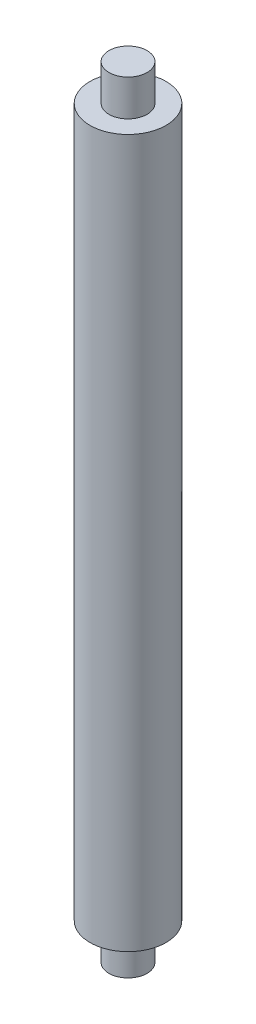
ISO-10303-21;
HEADER;
FILE_DESCRIPTION(('STEP AP214'),'2;1');
FILE_NAME('part.step','',(''),(''),'','','');
FILE_SCHEMA(('AUTOMOTIVE_DESIGN { 1 0 10303 214 1 1 1 1 }'));
ENDSEC;
DATA;
#1=APPLICATION_CONTEXT('core data for automotive mechanical design processes');
#2=APPLICATION_PROTOCOL_DEFINITION('international standard','automotive_design',2000,#1);
#3=PRODUCT_CONTEXT('',#1,'mechanical');
#4=PRODUCT('Part','Part','',(#3));
#5=PRODUCT_RELATED_PRODUCT_CATEGORY('part','',(#4));
#6=PRODUCT_DEFINITION_FORMATION('','',#4);
#7=PRODUCT_DEFINITION_CONTEXT('part definition',#1,'design');
#8=PRODUCT_DEFINITION('design','',#6,#7);
#9=PRODUCT_DEFINITION_SHAPE('','',#8);
#10=(LENGTH_UNIT() NAMED_UNIT(*) SI_UNIT(.MILLI.,.METRE.));
#11=(NAMED_UNIT(*) PLANE_ANGLE_UNIT() SI_UNIT($,.RADIAN.));
#12=(NAMED_UNIT(*) SI_UNIT($,.STERADIAN.) SOLID_ANGLE_UNIT());
#13=UNCERTAINTY_MEASURE_WITH_UNIT(LENGTH_MEASURE(1.E-05),#10,'distance_accuracy_value','');
#14=(GEOMETRIC_REPRESENTATION_CONTEXT(3) GLOBAL_UNCERTAINTY_ASSIGNED_CONTEXT((#13)) GLOBAL_UNIT_ASSIGNED_CONTEXT((#10,
#11,#12)) REPRESENTATION_CONTEXT('',''));
#15=CARTESIAN_POINT('',(0.,0.,0.));
#16=DIRECTION('',(0.,0.,1.));
#17=DIRECTION('',(1.,0.,0.));
#18=AXIS2_PLACEMENT_3D('',#15,#16,#17);
#19=CARTESIAN_POINT('',(0.,92.964,0.));
#20=DIRECTION('',(0.,-1.,0.));
#21=DIRECTION('',(0.,0.,1.));
#22=AXIS2_PLACEMENT_3D('',#19,#20,#21);
#23=CYLINDRICAL_SURFACE('',#22,5.);
#24=CARTESIAN_POINT('',(0.,92.964,0.));
#25=DIRECTION('',(0.,-1.,0.));
#26=DIRECTION('',(0.,0.,-1.));
#27=AXIS2_PLACEMENT_3D('',#24,#25,#26);
#28=CIRCLE('',#27,5.);
#29=CARTESIAN_POINT('',(0.,92.964,-5.));
#30=VERTEX_POINT('',#29);
#31=EDGE_CURVE('E55',#30,#30,#28,.T.);
#32=ORIENTED_EDGE('',*,*,#31,.T.);
#33=EDGE_LOOP('',(#32));
#34=FACE_BOUND('',#33,.T.);
#35=CARTESIAN_POINT('',(0.,0.,0.));
#36=DIRECTION('',(0.,-1.,0.));
#37=DIRECTION('',(0.,0.,-1.));
#38=AXIS2_PLACEMENT_3D('',#35,#36,#37);
#39=CIRCLE('',#38,5.);
#40=CARTESIAN_POINT('',(0.,0.,-5.));
#41=VERTEX_POINT('',#40);
#42=EDGE_CURVE('E46',#41,#41,#39,.T.);
#43=ORIENTED_EDGE('',*,*,#42,.F.);
#44=EDGE_LOOP('',(#43));
#45=FACE_BOUND('',#44,.T.);
#46=ADVANCED_FACE('F43',(#34,#45),#23,.T.);
#47=CARTESIAN_POINT('',(0.,92.964,0.));
#48=DIRECTION('',(0.,1.,0.));
#49=DIRECTION('',(0.,0.,-1.));
#50=AXIS2_PLACEMENT_3D('',#47,#48,#49);
#51=PLANE('',#50);
#52=CARTESIAN_POINT('',(0.,92.964,0.));
#53=DIRECTION('',(0.,-1.,0.));
#54=DIRECTION('',(0.,0.,-1.));
#55=AXIS2_PLACEMENT_3D('',#52,#53,#54);
#56=CIRCLE('',#55,2.5);
#57=CARTESIAN_POINT('',(0.,92.964,2.5));
#58=VERTEX_POINT('',#57);
#59=EDGE_CURVE('E50',#58,#58,#56,.T.);
#60=ORIENTED_EDGE('',*,*,#59,.T.);
#61=EDGE_LOOP('',(#60));
#62=FACE_BOUND('',#61,.T.);
#63=ORIENTED_EDGE('',*,*,#31,.F.);
#64=EDGE_LOOP('',(#63));
#65=FACE_BOUND('',#64,.T.);
#66=ADVANCED_FACE('F71',(#62,#65),#51,.T.);
#67=CARTESIAN_POINT('',(0.,0.,0.));
#68=DIRECTION('',(0.,1.,0.));
#69=DIRECTION('',(0.,0.,-1.));
#70=AXIS2_PLACEMENT_3D('',#67,#68,#69);
#71=PLANE('',#70);
#72=CARTESIAN_POINT('',(0.,0.,0.));
#73=DIRECTION('',(0.,1.,0.));
#74=DIRECTION('',(0.,0.,1.));
#75=AXIS2_PLACEMENT_3D('',#72,#73,#74);
#76=CIRCLE('',#75,2.5);
#77=CARTESIAN_POINT('',(0.,0.,-2.5));
#78=VERTEX_POINT('',#77);
#79=EDGE_CURVE('E10',#78,#78,#76,.T.);
#80=ORIENTED_EDGE('',*,*,#79,.T.);
#81=EDGE_LOOP('',(#80));
#82=FACE_BOUND('',#81,.T.);
#83=ORIENTED_EDGE('',*,*,#42,.T.);
#84=EDGE_LOOP('',(#83));
#85=FACE_BOUND('',#84,.T.);
#86=ADVANCED_FACE('F68',(#82,#85),#71,.F.);
#87=CARTESIAN_POINT('',(0.,97.7265,0.));
#88=DIRECTION('',(0.,-1.,0.));
#89=DIRECTION('',(0.,0.,1.));
#90=AXIS2_PLACEMENT_3D('',#87,#88,#89);
#91=CYLINDRICAL_SURFACE('',#90,2.5);
#92=CARTESIAN_POINT('',(0.,97.7265,0.));
#93=DIRECTION('',(0.,-1.,0.));
#94=DIRECTION('',(0.,0.,-1.));
#95=AXIS2_PLACEMENT_3D('',#92,#93,#94);
#96=CIRCLE('',#95,2.5);
#97=CARTESIAN_POINT('',(0.,97.7265,2.5));
#98=VERTEX_POINT('',#97);
#99=EDGE_CURVE('E60',#98,#98,#96,.T.);
#100=CARTESIAN_POINT('',(0.,97.7265,2.5));
#101=CARTESIAN_POINT('',(0.,97.676890625,2.5));
#102=CARTESIAN_POINT('',(0.,97.62728125,2.5));
#103=CARTESIAN_POINT('',(0.,97.5280625,2.5));
#104=CARTESIAN_POINT('',(0.,97.478453125,2.5));
#105=CARTESIAN_POINT('',(0.,97.379234375,2.5));
#106=CARTESIAN_POINT('',(0.,97.329625,2.5));
#107=CARTESIAN_POINT('',(0.,97.23040625,2.5));
#108=CARTESIAN_POINT('',(0.,97.180796875,2.5));
#109=CARTESIAN_POINT('',(0.,97.081578125,2.5));
#110=CARTESIAN_POINT('',(0.,97.03196875,2.5));
#111=CARTESIAN_POINT('',(0.,96.93275,2.5));
#112=CARTESIAN_POINT('',(0.,96.883140625,2.5));
#113=CARTESIAN_POINT('',(0.,96.783921875,2.5));
#114=CARTESIAN_POINT('',(0.,96.7343125,2.5));
#115=CARTESIAN_POINT('',(0.,96.63509375,2.5));
#116=CARTESIAN_POINT('',(0.,96.585484375,2.5));
#117=CARTESIAN_POINT('',(0.,96.486265625,2.5));
#118=CARTESIAN_POINT('',(0.,96.43665625,2.5));
#119=CARTESIAN_POINT('',(0.,96.3374375,2.5));
#120=CARTESIAN_POINT('',(0.,96.287828125,2.5));
#121=CARTESIAN_POINT('',(0.,96.188609375,2.5));
#122=CARTESIAN_POINT('',(0.,96.139,2.5));
#123=CARTESIAN_POINT('',(0.,96.03978125,2.5));
#124=CARTESIAN_POINT('',(0.,95.990171875,2.5));
#125=CARTESIAN_POINT('',(0.,95.890953125,2.5));
#126=CARTESIAN_POINT('',(0.,95.84134375,2.5));
#127=CARTESIAN_POINT('',(0.,95.742125,2.5));
#128=CARTESIAN_POINT('',(0.,95.692515625,2.5));
#129=CARTESIAN_POINT('',(0.,95.593296875,2.5));
#130=CARTESIAN_POINT('',(0.,95.5436875,2.5));
#131=CARTESIAN_POINT('',(0.,95.44446875,2.5));
#132=CARTESIAN_POINT('',(0.,95.394859375,2.5));
#133=CARTESIAN_POINT('',(0.,95.295640625,2.5));
#134=CARTESIAN_POINT('',(0.,95.24603125,2.5));
#135=CARTESIAN_POINT('',(0.,95.1468125,2.5));
#136=CARTESIAN_POINT('',(0.,95.097203125,2.5));
#137=CARTESIAN_POINT('',(0.,94.997984375,2.5));
#138=CARTESIAN_POINT('',(0.,94.948375,2.5));
#139=CARTESIAN_POINT('',(0.,94.84915625,2.5));
#140=CARTESIAN_POINT('',(0.,94.799546875,2.5));
#141=CARTESIAN_POINT('',(0.,94.700328125,2.5));
#142=CARTESIAN_POINT('',(0.,94.65071875,2.5));
#143=CARTESIAN_POINT('',(0.,94.5515,2.5));
#144=CARTESIAN_POINT('',(0.,94.501890625,2.5));
#145=CARTESIAN_POINT('',(0.,94.402671875,2.5));
#146=CARTESIAN_POINT('',(0.,94.3530625,2.5));
#147=CARTESIAN_POINT('',(0.,94.25384375,2.5));
#148=CARTESIAN_POINT('',(0.,94.204234375,2.5));
#149=CARTESIAN_POINT('',(0.,94.105015625,2.5));
#150=CARTESIAN_POINT('',(0.,94.05540625,2.5));
#151=CARTESIAN_POINT('',(0.,93.9561875,2.5));
#152=CARTESIAN_POINT('',(0.,93.906578125,2.5));
#153=CARTESIAN_POINT('',(0.,93.807359375,2.5));
#154=CARTESIAN_POINT('',(0.,93.75775,2.5));
#155=CARTESIAN_POINT('',(0.,93.65853125,2.5));
#156=CARTESIAN_POINT('',(0.,93.608921875,2.5));
#157=CARTESIAN_POINT('',(0.,93.509703125,2.5));
#158=CARTESIAN_POINT('',(0.,93.46009375,2.5));
#159=CARTESIAN_POINT('',(0.,93.360875,2.5));
#160=CARTESIAN_POINT('',(0.,93.311265625,2.5));
#161=CARTESIAN_POINT('',(0.,93.212046875,2.5));
#162=CARTESIAN_POINT('',(0.,93.1624375,2.5));
#163=CARTESIAN_POINT('',(0.,93.06321875,2.5));
#164=CARTESIAN_POINT('',(0.,93.013609375,2.5));
#165=CARTESIAN_POINT('',(0.,92.964,2.5));
#166=B_SPLINE_CURVE_WITH_KNOTS('',3,(#100,#101,#102,#103,#104,#105,#106,#107,#108,#109,#110,
#111,#112,#113,#114,#115,#116,#117,#118,#119,#120,#121,#122,#123,#124,#125,#126,#127,#128,#129,
#130,#131,#132,#133,#134,#135,#136,#137,#138,#139,#140,#141,#142,#143,#144,#145,#146,#147,#148,
#149,#150,#151,#152,#153,#154,#155,#156,#157,#158,#159,#160,#161,#162,#163,#164,#165),
.UNSPECIFIED.,.F.,.F.,(4,2,2,2,2,2,2,2,2,2,2,2,2,2,2,2,2,2,2,2,2,2,2,2,2,2,2,2,2,2,2,2,4),(0.,
0.148828125,0.29765625,0.446484375,0.5953125,0.744140625,0.892968750000001,1.041796875,1.190625,
1.339453125,1.48828125,1.637109375,1.7859375,1.934765625,2.08359375,2.232421875,2.38125,
2.530078125,2.67890625,2.827734375,2.9765625,3.125390625,3.27421875,3.423046875,3.571875,
3.720703125,3.86953125,4.018359375,4.1671875,4.316015625,4.46484375,4.613671875,4.7625),.UNSPECIFIED.);
#167=EDGE_CURVE('BSEAM80',#98,#58,#166,.T.);
#168=ORIENTED_EDGE('',*,*,#99,.T.);
#169=ORIENTED_EDGE('',*,*,#59,.F.);
#170=ORIENTED_EDGE('',*,*,#167,.T.);
#171=ORIENTED_EDGE('',*,*,#167,.F.);
#172=EDGE_LOOP('',(#168,#170,#169,#171));
#173=FACE_BOUND('',#172,.T.);
#174=ADVANCED_FACE('F80',(#173),#91,.T.);
#175=CARTESIAN_POINT('',(0.,97.7265,0.));
#176=DIRECTION('',(0.,1.,0.));
#177=DIRECTION('',(0.,0.,-1.));
#178=AXIS2_PLACEMENT_3D('',#175,#176,#177);
#179=PLANE('',#178);
#180=ORIENTED_EDGE('',*,*,#99,.F.);
#181=EDGE_LOOP('',(#180));
#182=FACE_BOUND('',#181,.T.);
#183=ADVANCED_FACE('F85',(#182),#179,.T.);
#184=CARTESIAN_POINT('',(0.,-4.7625,0.));
#185=DIRECTION('',(0.,1.,0.));
#186=DIRECTION('',(0.,0.,-1.));
#187=AXIS2_PLACEMENT_3D('',#184,#185,#186);
#188=CYLINDRICAL_SURFACE('',#187,2.5);
#189=CARTESIAN_POINT('',(0.,-4.7625,0.));
#190=DIRECTION('',(0.,1.,0.));
#191=DIRECTION('',(0.,0.,1.));
#192=AXIS2_PLACEMENT_3D('',#189,#190,#191);
#193=CIRCLE('',#192,2.5);
#194=CARTESIAN_POINT('',(0.,-4.7625,-2.5));
#195=VERTEX_POINT('',#194);
#196=EDGE_CURVE('E59',#195,#195,#193,.T.);
#197=CARTESIAN_POINT('',(0.,-4.7625,-2.5));
#198=CARTESIAN_POINT('',(0.,-4.712890625,-2.5));
#199=CARTESIAN_POINT('',(0.,-4.66328125,-2.5));
#200=CARTESIAN_POINT('',(0.,-4.5640625,-2.5));
#201=CARTESIAN_POINT('',(0.,-4.514453125,-2.5));
#202=CARTESIAN_POINT('',(0.,-4.415234375,-2.5));
#203=CARTESIAN_POINT('',(0.,-4.365625,-2.5));
#204=CARTESIAN_POINT('',(0.,-4.26640625,-2.5));
#205=CARTESIAN_POINT('',(0.,-4.216796875,-2.5));
#206=CARTESIAN_POINT('',(0.,-4.117578125,-2.5));
#207=CARTESIAN_POINT('',(0.,-4.06796875,-2.5));
#208=CARTESIAN_POINT('',(0.,-3.96875,-2.5));
#209=CARTESIAN_POINT('',(0.,-3.919140625,-2.5));
#210=CARTESIAN_POINT('',(0.,-3.819921875,-2.5));
#211=CARTESIAN_POINT('',(0.,-3.7703125,-2.5));
#212=CARTESIAN_POINT('',(0.,-3.67109375,-2.5));
#213=CARTESIAN_POINT('',(0.,-3.621484375,-2.5));
#214=CARTESIAN_POINT('',(0.,-3.522265625,-2.5));
#215=CARTESIAN_POINT('',(0.,-3.47265625,-2.5));
#216=CARTESIAN_POINT('',(0.,-3.3734375,-2.5));
#217=CARTESIAN_POINT('',(0.,-3.323828125,-2.5));
#218=CARTESIAN_POINT('',(0.,-3.224609375,-2.5));
#219=CARTESIAN_POINT('',(0.,-3.175,-2.5));
#220=CARTESIAN_POINT('',(0.,-3.07578125,-2.5));
#221=CARTESIAN_POINT('',(0.,-3.026171875,-2.5));
#222=CARTESIAN_POINT('',(0.,-2.926953125,-2.5));
#223=CARTESIAN_POINT('',(0.,-2.87734375,-2.5));
#224=CARTESIAN_POINT('',(0.,-2.778125,-2.5));
#225=CARTESIAN_POINT('',(0.,-2.728515625,-2.5));
#226=CARTESIAN_POINT('',(0.,-2.629296875,-2.5));
#227=CARTESIAN_POINT('',(0.,-2.5796875,-2.5));
#228=CARTESIAN_POINT('',(0.,-2.48046875,-2.5));
#229=CARTESIAN_POINT('',(0.,-2.430859375,-2.5));
#230=CARTESIAN_POINT('',(0.,-2.331640625,-2.5));
#231=CARTESIAN_POINT('',(0.,-2.28203125,-2.5));
#232=CARTESIAN_POINT('',(0.,-2.1828125,-2.5));
#233=CARTESIAN_POINT('',(0.,-2.133203125,-2.5));
#234=CARTESIAN_POINT('',(0.,-2.033984375,-2.5));
#235=CARTESIAN_POINT('',(0.,-1.984375,-2.5));
#236=CARTESIAN_POINT('',(0.,-1.88515625,-2.5));
#237=CARTESIAN_POINT('',(0.,-1.835546875,-2.5));
#238=CARTESIAN_POINT('',(0.,-1.736328125,-2.5));
#239=CARTESIAN_POINT('',(0.,-1.68671875,-2.5));
#240=CARTESIAN_POINT('',(0.,-1.5875,-2.5));
#241=CARTESIAN_POINT('',(0.,-1.537890625,-2.5));
#242=CARTESIAN_POINT('',(0.,-1.438671875,-2.5));
#243=CARTESIAN_POINT('',(0.,-1.3890625,-2.5));
#244=CARTESIAN_POINT('',(0.,-1.28984375,-2.5));
#245=CARTESIAN_POINT('',(0.,-1.240234375,-2.5));
#246=CARTESIAN_POINT('',(0.,-1.141015625,-2.5));
#247=CARTESIAN_POINT('',(0.,-1.09140625,-2.5));
#248=CARTESIAN_POINT('',(0.,-0.9921875,-2.5));
#249=CARTESIAN_POINT('',(0.,-0.942578125,-2.5));
#250=CARTESIAN_POINT('',(0.,-0.843359375,-2.5));
#251=CARTESIAN_POINT('',(0.,-0.79375,-2.5));
#252=CARTESIAN_POINT('',(0.,-0.69453125,-2.5));
#253=CARTESIAN_POINT('',(0.,-0.644921875,-2.5));
#254=CARTESIAN_POINT('',(0.,-0.545703125,-2.5));
#255=CARTESIAN_POINT('',(0.,-0.49609375,-2.5));
#256=CARTESIAN_POINT('',(0.,-0.396875,-2.5));
#257=CARTESIAN_POINT('',(0.,-0.347265625,-2.5));
#258=CARTESIAN_POINT('',(0.,-0.248046875,-2.5));
#259=CARTESIAN_POINT('',(0.,-0.1984375,-2.5));
#260=CARTESIAN_POINT('',(0.,-0.09921875,-2.5));
#261=CARTESIAN_POINT('',(0.,-0.049609375,-2.5));
#262=CARTESIAN_POINT('',(0.,0.,-2.5));
#263=B_SPLINE_CURVE_WITH_KNOTS('',3,(#197,#198,#199,#200,#201,#202,#203,#204,#205,#206,#207,
#208,#209,#210,#211,#212,#213,#214,#215,#216,#217,#218,#219,#220,#221,#222,#223,#224,#225,#226,
#227,#228,#229,#230,#231,#232,#233,#234,#235,#236,#237,#238,#239,#240,#241,#242,#243,#244,#245,
#246,#247,#248,#249,#250,#251,#252,#253,#254,#255,#256,#257,#258,#259,#260,#261,#262),
.UNSPECIFIED.,.F.,.F.,(4,2,2,2,2,2,2,2,2,2,2,2,2,2,2,2,2,2,2,2,2,2,2,2,2,2,2,2,2,2,2,2,4),(0.,
0.148828124999999,0.297656249999999,0.446484374999999,0.595312499999999,0.744140625,0.89296875,
1.041796875,1.190625,1.339453125,1.48828125,1.637109375,1.7859375,1.934765625,2.08359375,
2.232421875,2.38125,2.530078125,2.67890625,2.827734375,2.9765625,3.125390625,3.27421875,
3.423046875,3.571875,3.720703125,3.86953125,4.018359375,4.1671875,4.316015625,4.46484375,
4.613671875,4.7625),.UNSPECIFIED.);
#264=EDGE_CURVE('BSEAM89',#195,#78,#263,.T.);
#265=ORIENTED_EDGE('',*,*,#196,.T.);
#266=ORIENTED_EDGE('',*,*,#79,.F.);
#267=ORIENTED_EDGE('',*,*,#264,.T.);
#268=ORIENTED_EDGE('',*,*,#264,.F.);
#269=EDGE_LOOP('',(#265,#267,#266,#268));
#270=FACE_BOUND('',#269,.T.);
#271=ADVANCED_FACE('F89',(#270),#188,.T.);
#272=CARTESIAN_POINT('',(0.,-4.7625,0.));
#273=DIRECTION('',(0.,-1.,0.));
#274=DIRECTION('',(0.,0.,1.));
#275=AXIS2_PLACEMENT_3D('',#272,#273,#274);
#276=PLANE('',#275);
#277=ORIENTED_EDGE('',*,*,#196,.F.);
#278=EDGE_LOOP('',(#277));
#279=FACE_BOUND('',#278,.T.);
#280=ADVANCED_FACE('F93',(#279),#276,.T.);
#281=CLOSED_SHELL('',(#46,#66,#86,#174,#183,#271,#280));
#282=MANIFOLD_SOLID_BREP('B2',#281);
#283=ADVANCED_BREP_SHAPE_REPRESENTATION('',(#18,#282),#14);
#284=SHAPE_DEFINITION_REPRESENTATION(#9,#283);
ENDSEC;
END-ISO-10303-21;
